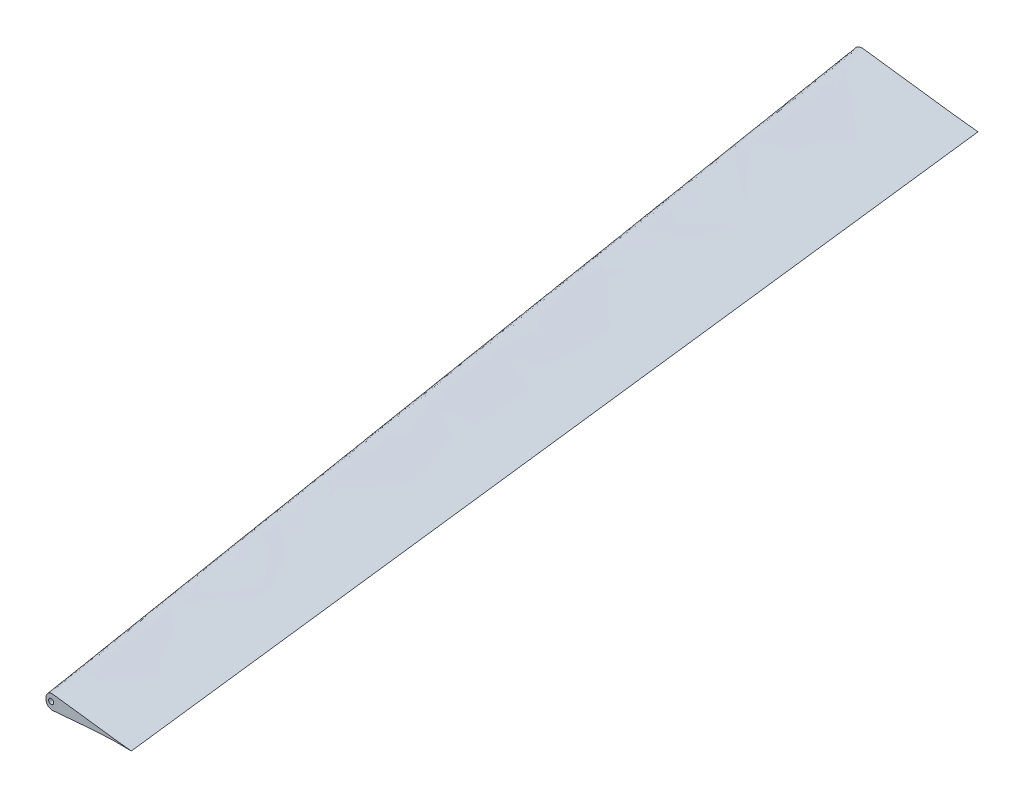
ISO-10303-21;
HEADER;
FILE_DESCRIPTION(('STEP AP214'),'2;1');
FILE_NAME('part.step','',(''),(''),'','','');
FILE_SCHEMA(('AUTOMOTIVE_DESIGN { 1 0 10303 214 1 1 1 1 }'));
ENDSEC;
DATA;
#1=APPLICATION_CONTEXT('core data for automotive mechanical design processes');
#2=APPLICATION_PROTOCOL_DEFINITION('international standard','automotive_design',2000,#1);
#3=PRODUCT_CONTEXT('',#1,'mechanical');
#4=PRODUCT('Part','Part','',(#3));
#5=PRODUCT_RELATED_PRODUCT_CATEGORY('part','',(#4));
#6=PRODUCT_DEFINITION_FORMATION('','',#4);
#7=PRODUCT_DEFINITION_CONTEXT('part definition',#1,'design');
#8=PRODUCT_DEFINITION('design','',#6,#7);
#9=PRODUCT_DEFINITION_SHAPE('','',#8);
#10=(LENGTH_UNIT() NAMED_UNIT(*) SI_UNIT(.MILLI.,.METRE.));
#11=(NAMED_UNIT(*) PLANE_ANGLE_UNIT() SI_UNIT($,.RADIAN.));
#12=(NAMED_UNIT(*) SI_UNIT($,.STERADIAN.) SOLID_ANGLE_UNIT());
#13=UNCERTAINTY_MEASURE_WITH_UNIT(LENGTH_MEASURE(1.E-05),#10,'distance_accuracy_value','');
#14=(GEOMETRIC_REPRESENTATION_CONTEXT(3) GLOBAL_UNCERTAINTY_ASSIGNED_CONTEXT((#13)) GLOBAL_UNIT_ASSIGNED_CONTEXT((#10,
#11,#12)) REPRESENTATION_CONTEXT('',''));
#15=CARTESIAN_POINT('',(0.,0.,0.));
#16=DIRECTION('',(0.,0.,1.));
#17=DIRECTION('',(1.,0.,0.));
#18=AXIS2_PLACEMENT_3D('',#15,#16,#17);
#19=CARTESIAN_POINT('',(572.039507325932,-0.442214374208596,893.75));
#20=DIRECTION('',(0.,0.,1.));
#21=DIRECTION('',(1.,0.,0.));
#22=AXIS2_PLACEMENT_3D('',#19,#20,#21);
#23=PLANE('',#22);
#24=CARTESIAN_POINT('',(544.806644245559,2.04010066238125,893.75));
#25=DIRECTION('',(0.,0.,-1.));
#26=DIRECTION('',(-1.,0.,0.));
#27=AXIS2_PLACEMENT_3D('',#24,#25,#26);
#28=CIRCLE('',#27,1.70999999999994);
#29=CARTESIAN_POINT('',(543.625149017303,0.803909323790661,893.75));
#30=VERTEX_POINT('',#29);
#31=EDGE_CURVE('E182',#30,#30,#28,.T.);
#32=ORIENTED_EDGE('',*,*,#31,.T.);
#33=EDGE_LOOP('',(#32));
#34=FACE_BOUND('',#33,.T.);
#35=CARTESIAN_POINT('',(545.906853580853,-2.62601956861318,893.75));
#36=CARTESIAN_POINT('',(545.343753257404,-2.67841214158187,893.75));
#37=CARTESIAN_POINT('',(544.188046447115,-2.54948777973742,893.749999999999));
#38=CARTESIAN_POINT('',(542.666350876093,-1.66449411174579,893.75));
#39=CARTESIAN_POINT('',(541.630913820492,-0.23276783121427,893.750000000001));
#40=CARTESIAN_POINT('',(541.388775142327,0.91777924490032,893.75));
#41=CARTESIAN_POINT('',(541.388775142327,1.58908134144445,893.75));
#42=CARTESIAN_POINT('',(541.388775142328,1.785135488516,893.75));
#43=CARTESIAN_POINT('',(541.388775142326,2.07963539451153,893.75));
#44=CARTESIAN_POINT('',(541.388775142328,2.37410697351867,893.75));
#45=CARTESIAN_POINT('',(541.388775142327,2.57010474744107,893.75));
#46=CARTESIAN_POINT('',(541.388775142327,3.25414214498161,893.75));
#47=CARTESIAN_POINT('',(541.641485491526,4.42573116966888,893.750000000002));
#48=CARTESIAN_POINT('',(542.711711982757,5.86990965965612,893.749999999998));
#49=CARTESIAN_POINT('',(544.282204790229,6.74484622135366,893.750000000001));
#50=CARTESIAN_POINT('',(545.477140293074,6.84407951933252,893.75));
#51=CARTESIAN_POINT('',(549.481331748966,6.32166351695127,893.75));
#52=CARTESIAN_POINT('',(556.332896968704,5.4092855888834,893.749999999999));
#53=CARTESIAN_POINT('',(566.615586924358,4.02673030335584,893.750000000002));
#54=CARTESIAN_POINT('',(576.887621965339,2.65466190552364,893.749999999999));
#55=CARTESIAN_POINT('',(583.72414637341,1.8134350196239,893.75));
#56=CARTESIAN_POINT('',(588.059111722785,1.28851275945729,893.75));
#57=CARTESIAN_POINT('',(589.888433897396,1.08166745911093,893.75));
#58=CARTESIAN_POINT('',(592.599997890354,0.775065223421604,893.75));
#59=CARTESIAN_POINT('',(595.305520361951,0.469146115241552,893.75));
#60=CARTESIAN_POINT('',(597.122391809964,0.263708644701377,893.75));
#61=CARTESIAN_POINT('',(598.038775142328,0.160091256662315,893.75));
#62=B_SPLINE_CURVE_WITH_KNOTS('',3,(#35,#36,#37,#38,#39,#40,#41,#42,#43,#44,#45,#46,#47,#48,#49,
#50,#51,#52,#53,#54,#55,#56,#57,#58,#59,#60,#61),.UNSPECIFIED.,.F.,.F.,(4,1,1,1,2,1,1,1,2,1,1,1,
2,1,1,1,2,1,1,1,4),(0.,0.0254001879600956,0.0508003759201914,0.076200563880287,
0.101600751840383,0.105936626506359,0.110272501172336,0.114608375838314,0.11894425050429,
0.144920127273649,0.170896004043008,0.196871880812366,0.222847757581725,0.375715324521794,
0.528582891461863,0.681450458401932,0.834318025342001,0.875738519006501,0.917159012671001,
0.9585795063355,1.),.UNSPECIFIED.);
#63=CARTESIAN_POINT('',(587.134573804226,1.39725788910853,893.75));
#64=VERTEX_POINT('',#63);
#65=CARTESIAN_POINT('',(598.038775142328,0.160091256662334,893.75));
#66=VERTEX_POINT('',#65);
#67=EDGE_CURVE('E245',#64,#66,#62,.T.);
#68=ORIENTED_EDGE('',*,*,#67,.F.);
#69=CARTESIAN_POINT('',(545.906853580853,-2.62601956861318,893.75));
#70=CARTESIAN_POINT('',(545.343753257404,-2.67841214158187,893.75));
#71=CARTESIAN_POINT('',(544.188046447115,-2.54948777973742,893.749999999999));
#72=CARTESIAN_POINT('',(542.666350876093,-1.66449411174579,893.75));
#73=CARTESIAN_POINT('',(541.630913820492,-0.23276783121427,893.750000000001));
#74=CARTESIAN_POINT('',(541.388775142327,0.91777924490032,893.75));
#75=CARTESIAN_POINT('',(541.388775142327,1.58908134144445,893.75));
#76=CARTESIAN_POINT('',(541.388775142328,1.785135488516,893.75));
#77=CARTESIAN_POINT('',(541.388775142326,2.07963539451153,893.75));
#78=CARTESIAN_POINT('',(541.388775142328,2.37410697351867,893.75));
#79=CARTESIAN_POINT('',(541.388775142327,2.57010474744107,893.75));
#80=CARTESIAN_POINT('',(541.388775142327,3.25414214498161,893.75));
#81=CARTESIAN_POINT('',(541.641485491526,4.42573116966888,893.750000000002));
#82=CARTESIAN_POINT('',(542.711711982757,5.86990965965612,893.749999999998));
#83=CARTESIAN_POINT('',(544.282204790229,6.74484622135366,893.750000000001));
#84=CARTESIAN_POINT('',(545.477140293074,6.84407951933252,893.75));
#85=CARTESIAN_POINT('',(549.481331748966,6.32166351695127,893.75));
#86=CARTESIAN_POINT('',(556.332896968704,5.4092855888834,893.749999999999));
#87=CARTESIAN_POINT('',(566.615586924358,4.02673030335584,893.750000000002));
#88=CARTESIAN_POINT('',(576.887621965339,2.65466190552364,893.749999999999));
#89=CARTESIAN_POINT('',(583.72414637341,1.8134350196239,893.75));
#90=CARTESIAN_POINT('',(588.059111722785,1.28851275945729,893.75));
#91=CARTESIAN_POINT('',(589.888433897396,1.08166745911093,893.75));
#92=CARTESIAN_POINT('',(592.599997890354,0.775065223421604,893.75));
#93=CARTESIAN_POINT('',(595.305520361951,0.469146115241552,893.75));
#94=CARTESIAN_POINT('',(597.122391809964,0.263708644701377,893.75));
#95=CARTESIAN_POINT('',(598.038775142328,0.160091256662315,893.75));
#96=B_SPLINE_CURVE_WITH_KNOTS('',3,(#69,#70,#71,#72,#73,#74,#75,#76,#77,#78,#79,#80,#81,#82,#83,
#84,#85,#86,#87,#88,#89,#90,#91,#92,#93,#94,#95),.UNSPECIFIED.,.F.,.F.,(4,1,1,1,2,1,1,1,2,1,1,1,
2,1,1,1,2,1,1,1,4),(0.,0.0254001879600956,0.0508003759201914,0.076200563880287,
0.101600751840383,0.105936626506359,0.110272501172336,0.114608375838314,0.11894425050429,
0.144920127273649,0.170896004043008,0.196871880812366,0.222847757581725,0.375715324521794,
0.528582891461863,0.681450458401932,0.834318025342001,0.875738519006501,0.917159012671001,
0.9585795063355,1.),.UNSPECIFIED.);
#97=CARTESIAN_POINT('',(546.058723721344,6.76820190633752,893.75));
#98=VERTEX_POINT('',#97);
#99=EDGE_CURVE('E117',#98,#64,#96,.T.);
#100=ORIENTED_EDGE('',*,*,#99,.F.);
#101=CARTESIAN_POINT('',(545.906853580853,-2.62601956861318,893.75));
#102=CARTESIAN_POINT('',(545.343753257404,-2.67841214158187,893.75));
#103=CARTESIAN_POINT('',(544.188046447115,-2.54948777973742,893.749999999999));
#104=CARTESIAN_POINT('',(542.666350876093,-1.66449411174579,893.75));
#105=CARTESIAN_POINT('',(541.630913820492,-0.23276783121427,893.750000000001));
#106=CARTESIAN_POINT('',(541.388775142327,0.91777924490032,893.75));
#107=CARTESIAN_POINT('',(541.388775142327,1.58908134144445,893.75));
#108=CARTESIAN_POINT('',(541.388775142328,1.785135488516,893.75));
#109=CARTESIAN_POINT('',(541.388775142326,2.07963539451153,893.75));
#110=CARTESIAN_POINT('',(541.388775142328,2.37410697351867,893.75));
#111=CARTESIAN_POINT('',(541.388775142327,2.57010474744107,893.75));
#112=CARTESIAN_POINT('',(541.388775142327,3.25414214498161,893.75));
#113=CARTESIAN_POINT('',(541.641485491526,4.42573116966888,893.750000000002));
#114=CARTESIAN_POINT('',(542.711711982757,5.86990965965612,893.749999999998));
#115=CARTESIAN_POINT('',(544.282204790229,6.74484622135366,893.750000000001));
#116=CARTESIAN_POINT('',(545.477140293074,6.84407951933252,893.75));
#117=CARTESIAN_POINT('',(549.481331748966,6.32166351695127,893.75));
#118=CARTESIAN_POINT('',(556.332896968704,5.4092855888834,893.749999999999));
#119=CARTESIAN_POINT('',(566.615586924358,4.02673030335584,893.750000000002));
#120=CARTESIAN_POINT('',(576.887621965339,2.65466190552364,893.749999999999));
#121=CARTESIAN_POINT('',(583.72414637341,1.8134350196239,893.75));
#122=CARTESIAN_POINT('',(588.059111722785,1.28851275945729,893.75));
#123=CARTESIAN_POINT('',(589.888433897396,1.08166745911093,893.75));
#124=CARTESIAN_POINT('',(592.599997890354,0.775065223421604,893.75));
#125=CARTESIAN_POINT('',(595.305520361951,0.469146115241552,893.75));
#126=CARTESIAN_POINT('',(597.122391809964,0.263708644701377,893.75));
#127=CARTESIAN_POINT('',(598.038775142328,0.160091256662315,893.75));
#128=B_SPLINE_CURVE_WITH_KNOTS('',3,(#101,#102,#103,#104,#105,#106,#107,#108,#109,#110,#111,
#112,#113,#114,#115,#116,#117,#118,#119,#120,#121,#122,#123,#124,#125,#126,#127),.UNSPECIFIED.,
.F.,.F.,(4,1,1,1,2,1,1,1,2,1,1,1,2,1,1,1,2,1,1,1,4),(0.,0.0254001879600956,0.0508003759201914,
0.076200563880287,0.101600751840383,0.105936626506359,0.110272501172336,0.114608375838314,
0.11894425050429,0.144920127273649,0.170896004043008,0.196871880812366,0.222847757581725,
0.375715324521794,0.528582891461863,0.681450458401932,0.834318025342001,0.875738519006501,
0.917159012671001,0.9585795063355,1.),.UNSPECIFIED.);
#129=CARTESIAN_POINT('',(541.388775142327,2.66795130206855,893.75));
#130=VERTEX_POINT('',#129);
#131=EDGE_CURVE('E12',#98,#130,#128,.F.);
#132=ORIENTED_EDGE('',*,*,#131,.T.);
#133=CARTESIAN_POINT('',(545.906853580853,-2.62601956861318,893.75));
#134=CARTESIAN_POINT('',(545.343753257404,-2.67841214158187,893.75));
#135=CARTESIAN_POINT('',(544.188046447115,-2.54948777973742,893.749999999999));
#136=CARTESIAN_POINT('',(542.666350876093,-1.66449411174579,893.75));
#137=CARTESIAN_POINT('',(541.630913820492,-0.23276783121427,893.750000000001));
#138=CARTESIAN_POINT('',(541.388775142327,0.91777924490032,893.75));
#139=CARTESIAN_POINT('',(541.388775142327,1.58908134144445,893.75));
#140=CARTESIAN_POINT('',(541.388775142328,1.785135488516,893.75));
#141=CARTESIAN_POINT('',(541.388775142326,2.07963539451153,893.75));
#142=CARTESIAN_POINT('',(541.388775142328,2.37410697351867,893.75));
#143=CARTESIAN_POINT('',(541.388775142327,2.57010474744107,893.75));
#144=CARTESIAN_POINT('',(541.388775142327,3.25414214498161,893.75));
#145=CARTESIAN_POINT('',(541.641485491526,4.42573116966888,893.750000000002));
#146=CARTESIAN_POINT('',(542.711711982757,5.86990965965612,893.749999999998));
#147=CARTESIAN_POINT('',(544.282204790229,6.74484622135366,893.750000000001));
#148=CARTESIAN_POINT('',(545.477140293074,6.84407951933252,893.75));
#149=CARTESIAN_POINT('',(549.481331748966,6.32166351695127,893.75));
#150=CARTESIAN_POINT('',(556.332896968704,5.4092855888834,893.749999999999));
#151=CARTESIAN_POINT('',(566.615586924358,4.02673030335584,893.750000000002));
#152=CARTESIAN_POINT('',(576.887621965339,2.65466190552364,893.749999999999));
#153=CARTESIAN_POINT('',(583.72414637341,1.8134350196239,893.75));
#154=CARTESIAN_POINT('',(588.059111722785,1.28851275945729,893.75));
#155=CARTESIAN_POINT('',(589.888433897396,1.08166745911093,893.75));
#156=CARTESIAN_POINT('',(592.599997890354,0.775065223421604,893.75));
#157=CARTESIAN_POINT('',(595.305520361951,0.469146115241552,893.75));
#158=CARTESIAN_POINT('',(597.122391809964,0.263708644701377,893.75));
#159=CARTESIAN_POINT('',(598.038775142328,0.160091256662315,893.75));
#160=B_SPLINE_CURVE_WITH_KNOTS('',3,(#133,#134,#135,#136,#137,#138,#139,#140,#141,#142,#143,
#144,#145,#146,#147,#148,#149,#150,#151,#152,#153,#154,#155,#156,#157,#158,#159),.UNSPECIFIED.,
.F.,.F.,(4,1,1,1,2,1,1,1,2,1,1,1,2,1,1,1,2,1,1,1,4),(0.,0.0254001879600956,0.0508003759201914,
0.076200563880287,0.101600751840383,0.105936626506359,0.110272501172336,0.114608375838314,
0.11894425050429,0.144920127273649,0.170896004043008,0.196871880812366,0.222847757581725,
0.375715324521794,0.528582891461863,0.681450458401932,0.834318025342001,0.875738519006501,
0.917159012671001,0.9585795063355,1.),.UNSPECIFIED.);
#161=CARTESIAN_POINT('',(541.388775142327,1.49119744169071,893.75));
#162=VERTEX_POINT('',#161);
#163=EDGE_CURVE('E110',#130,#162,#160,.F.);
#164=ORIENTED_EDGE('',*,*,#163,.T.);
#165=CARTESIAN_POINT('',(545.906853580853,-2.62601956861318,893.75));
#166=CARTESIAN_POINT('',(545.343753257404,-2.67841214158187,893.75));
#167=CARTESIAN_POINT('',(544.188046447115,-2.54948777973742,893.749999999999));
#168=CARTESIAN_POINT('',(542.666350876093,-1.66449411174579,893.75));
#169=CARTESIAN_POINT('',(541.630913820492,-0.23276783121427,893.750000000001));
#170=CARTESIAN_POINT('',(541.388775142327,0.91777924490032,893.75));
#171=CARTESIAN_POINT('',(541.388775142327,1.58908134144445,893.75));
#172=CARTESIAN_POINT('',(541.388775142328,1.785135488516,893.75));
#173=CARTESIAN_POINT('',(541.388775142326,2.07963539451153,893.75));
#174=CARTESIAN_POINT('',(541.388775142328,2.37410697351867,893.75));
#175=CARTESIAN_POINT('',(541.388775142327,2.57010474744107,893.75));
#176=CARTESIAN_POINT('',(541.388775142327,3.25414214498161,893.75));
#177=CARTESIAN_POINT('',(541.641485491526,4.42573116966888,893.750000000002));
#178=CARTESIAN_POINT('',(542.711711982757,5.86990965965612,893.749999999998));
#179=CARTESIAN_POINT('',(544.282204790229,6.74484622135366,893.750000000001));
#180=CARTESIAN_POINT('',(545.477140293074,6.84407951933252,893.75));
#181=CARTESIAN_POINT('',(549.481331748966,6.32166351695127,893.75));
#182=CARTESIAN_POINT('',(556.332896968704,5.4092855888834,893.749999999999));
#183=CARTESIAN_POINT('',(566.615586924358,4.02673030335584,893.750000000002));
#184=CARTESIAN_POINT('',(576.887621965339,2.65466190552364,893.749999999999));
#185=CARTESIAN_POINT('',(583.72414637341,1.8134350196239,893.75));
#186=CARTESIAN_POINT('',(588.059111722785,1.28851275945729,893.75));
#187=CARTESIAN_POINT('',(589.888433897396,1.08166745911093,893.75));
#188=CARTESIAN_POINT('',(592.599997890354,0.775065223421604,893.75));
#189=CARTESIAN_POINT('',(595.305520361951,0.469146115241552,893.75));
#190=CARTESIAN_POINT('',(597.122391809964,0.263708644701377,893.75));
#191=CARTESIAN_POINT('',(598.038775142328,0.160091256662315,893.75));
#192=B_SPLINE_CURVE_WITH_KNOTS('',3,(#165,#166,#167,#168,#169,#170,#171,#172,#173,#174,#175,
#176,#177,#178,#179,#180,#181,#182,#183,#184,#185,#186,#187,#188,#189,#190,#191),.UNSPECIFIED.,
.F.,.F.,(4,1,1,1,2,1,1,1,2,1,1,1,2,1,1,1,2,1,1,1,4),(0.,0.0254001879600956,0.0508003759201914,
0.076200563880287,0.101600751840383,0.105936626506359,0.110272501172336,0.114608375838314,
0.11894425050429,0.144920127273649,0.170896004043008,0.196871880812366,0.222847757581725,
0.375715324521794,0.528582891461863,0.681450458401932,0.834318025342001,0.875738519006501,
0.917159012671001,0.9585795063355,1.),.UNSPECIFIED.);
#193=CARTESIAN_POINT('',(545.906853580853,-2.6260195686132,893.75));
#194=VERTEX_POINT('',#193);
#195=EDGE_CURVE('E252',#194,#162,#192,.T.);
#196=ORIENTED_EDGE('',*,*,#195,.F.);
#197=CARTESIAN_POINT('',(598.038775142328,0.160091256662334,893.75));
#198=CARTESIAN_POINT('',(596.963489152598,0.189650922548275,893.75));
#199=CARTESIAN_POINT('',(594.810181218029,0.249150148179762,893.75));
#200=CARTESIAN_POINT('',(591.572464730382,0.314137795246724,893.75));
#201=CARTESIAN_POINT('',(588.327122261804,0.333378718088079,893.75));
#202=CARTESIAN_POINT('',(585.075938240983,0.277778704308652,893.749999999999));
#203=CARTESIAN_POINT('',(581.821202512504,0.150032608922804,893.75));
#204=CARTESIAN_POINT('',(578.563801740404,-0.0240880564938324,893.75));
#205=CARTESIAN_POINT('',(575.303291550285,-0.22666185000221,893.75));
#206=CARTESIAN_POINT('',(570.952138822432,-0.510852540785951,893.75));
#207=CARTESIAN_POINT('',(565.507304178201,-0.902532391711503,893.749999999999));
#208=CARTESIAN_POINT('',(558.971254363327,-1.44090805514548,893.75));
#209=CARTESIAN_POINT('',(552.436151520526,-2.02251126759789,893.749999999999));
#210=CARTESIAN_POINT('',(548.082334278727,-2.42360620378526,893.75));
#211=CARTESIAN_POINT('',(545.906853580853,-2.6260195686132,893.75));
#212=B_SPLINE_CURVE_WITH_KNOTS('',3,(#197,#198,#199,#200,#201,#202,#203,#204,#205,#206,#207,
#208,#209,#210,#211),.UNSPECIFIED.,.F.,.F.,(4,1,1,1,1,1,1,1,1,1,1,1,4),(0.,0.0625,0.125,0.1875,
0.25,0.3125,0.375,0.4375,0.5,0.625,0.75,0.875,1.),.UNSPECIFIED.);
#213=EDGE_CURVE('E188',#66,#194,#212,.T.);
#214=ORIENTED_EDGE('',*,*,#213,.F.);
#215=EDGE_LOOP('',(#68,#100,#132,#164,#196,#214));
#216=FACE_BOUND('',#215,.T.);
#217=ADVANCED_FACE('F99',(#34,#216),#23,.T.);
#218=CARTESIAN_POINT('',(446.228775142328,2.16644841293175,256.250000000001));
#219=DIRECTION('',(0.,0.,-1.));
#220=DIRECTION('',(0.,1.,0.));
#221=AXIS2_PLACEMENT_3D('',#218,#219,#220);
#222=PLANE('',#221);
#223=CARTESIAN_POINT('',(445.225541599502,2.95993305744458,256.25));
#224=DIRECTION('',(0.,0.,1.));
#225=DIRECTION('',(1.,0.,0.));
#226=AXIS2_PLACEMENT_3D('',#223,#224,#225);
#227=CIRCLE('',#226,2.50000000000002);
#228=CARTESIAN_POINT('',(444.341854490053,0.621322980369886,256.25));
#229=VERTEX_POINT('',#228);
#230=EDGE_CURVE('E329',#229,#229,#227,.T.);
#231=ORIENTED_EDGE('',*,*,#230,.T.);
#232=EDGE_LOOP('',(#231));
#233=FACE_BOUND('',#232,.T.);
#234=CARTESIAN_POINT('',(523.038775142327,0.160091256662353,256.25));
#235=CARTESIAN_POINT('',(521.673146574801,0.314505746975743,256.25));
#236=CARTESIAN_POINT('',(518.918898392362,0.625934373617722,256.25));
#237=CARTESIAN_POINT('',(514.756573565062,1.09657718382981,256.250000000001));
#238=CARTESIAN_POINT('',(510.604449257664,1.56606659983249,256.25));
#239=CARTESIAN_POINT('',(507.869939246934,1.87526338994398,256.25));
#240=CARTESIAN_POINT('',(501.529545710944,2.64302355341035,256.25));
#241=CARTESIAN_POINT('',(491.578616671158,3.86635621279561,256.25));
#242=CARTESIAN_POINT('',(476.716016613758,5.84463513256558,256.25));
#243=CARTESIAN_POINT('',(461.873412085842,7.8418786764479,256.25));
#244=CARTESIAN_POINT('',(451.969936678682,9.16311978809007,256.25));
#245=CARTESIAN_POINT('',(446.167923779959,9.92567651045919,256.25));
#246=CARTESIAN_POINT('',(444.43417913672,9.78411692300939,256.25));
#247=CARTESIAN_POINT('',(442.151430173305,8.51557529366046,256.250000000001));
#248=CARTESIAN_POINT('',(440.595458182039,6.41770209319717,256.250000000001));
#249=CARTESIAN_POINT('',(440.228775142328,4.71650192128603,256.250000000001));
#250=CARTESIAN_POINT('',(440.228775142328,3.72412751189366,256.250000000001));
#251=CARTESIAN_POINT('',(440.228775142329,3.44067196187531,256.250000000001));
#252=CARTESIAN_POINT('',(440.228775142327,3.01617574176739,256.25));
#253=CARTESIAN_POINT('',(440.228775142328,2.59171998437292,256.250000000001));
#254=CARTESIAN_POINT('',(440.228775142328,2.30834575931876,256.250000000001));
#255=CARTESIAN_POINT('',(440.228775142328,1.33519301036386,256.250000000001));
#256=CARTESIAN_POINT('',(440.578228188802,-0.321395515843099,256.250000000001));
#257=CARTESIAN_POINT('',(442.054960574719,-2.38303525490176,256.250000000001));
#258=CARTESIAN_POINT('',(444.243251918863,-3.68209204839669,256.250000000001));
#259=CARTESIAN_POINT('',(445.942219837113,-3.88567187744866,256.250000000001));
#260=CARTESIAN_POINT('',(446.781414839283,-3.80804649168994,256.250000000001));
#261=B_SPLINE_CURVE_WITH_KNOTS('',3,(#234,#235,#236,#237,#238,#239,#240,#241,#242,#243,#244,
#245,#246,#247,#248,#249,#250,#251,#252,#253,#254,#255,#256,#257,#258,#259,#260),.UNSPECIFIED.,
.F.,.F.,(4,1,1,1,2,1,1,1,2,1,1,1,2,1,1,1,2,1,1,1,4),(0.,0.0414204936644997,0.0828409873289994,
0.124261480993499,0.165681974657999,0.318549541598068,0.471417108538137,0.624284675478206,
0.777152242418275,0.803128119187634,0.829103995956992,0.855079872726351,0.88105574949571,
0.885391624161686,0.889727498827664,0.894063373493641,0.898399248159617,0.923799436119713,
0.949199624079809,0.974599812039904,1.),.UNSPECIFIED.);
#262=CARTESIAN_POINT('',(446.781414839283,-3.80804649168991,256.250000000001));
#263=VERTEX_POINT('',#262);
#264=CARTESIAN_POINT('',(440.228775142328,2.16644841295228,256.250000000001));
#265=VERTEX_POINT('',#264);
#266=EDGE_CURVE('E160',#263,#265,#261,.F.);
#267=ORIENTED_EDGE('',*,*,#266,.T.);
#268=CARTESIAN_POINT('',(523.038775142327,0.160091256662353,256.25));
#269=CARTESIAN_POINT('',(521.673146574801,0.314505746975743,256.25));
#270=CARTESIAN_POINT('',(518.918898392362,0.625934373617722,256.25));
#271=CARTESIAN_POINT('',(514.756573565062,1.09657718382981,256.250000000001));
#272=CARTESIAN_POINT('',(510.604449257664,1.56606659983249,256.25));
#273=CARTESIAN_POINT('',(507.869939246934,1.87526338994398,256.25));
#274=CARTESIAN_POINT('',(501.529545710944,2.64302355341035,256.25));
#275=CARTESIAN_POINT('',(491.578616671158,3.86635621279561,256.25));
#276=CARTESIAN_POINT('',(476.716016613758,5.84463513256558,256.25));
#277=CARTESIAN_POINT('',(461.873412085842,7.8418786764479,256.25));
#278=CARTESIAN_POINT('',(451.969936678682,9.16311978809007,256.25));
#279=CARTESIAN_POINT('',(446.167923779959,9.92567651045919,256.25));
#280=CARTESIAN_POINT('',(444.43417913672,9.78411692300939,256.25));
#281=CARTESIAN_POINT('',(442.151430173305,8.51557529366046,256.250000000001));
#282=CARTESIAN_POINT('',(440.595458182039,6.41770209319717,256.250000000001));
#283=CARTESIAN_POINT('',(440.228775142328,4.71650192128603,256.250000000001));
#284=CARTESIAN_POINT('',(440.228775142328,3.72412751189366,256.250000000001));
#285=CARTESIAN_POINT('',(440.228775142329,3.44067196187531,256.250000000001));
#286=CARTESIAN_POINT('',(440.228775142327,3.01617574176739,256.25));
#287=CARTESIAN_POINT('',(440.228775142328,2.59171998437292,256.250000000001));
#288=CARTESIAN_POINT('',(440.228775142328,2.30834575931876,256.250000000001));
#289=CARTESIAN_POINT('',(440.228775142328,1.33519301036386,256.250000000001));
#290=CARTESIAN_POINT('',(440.578228188802,-0.321395515843099,256.250000000001));
#291=CARTESIAN_POINT('',(442.054960574719,-2.38303525490176,256.250000000001));
#292=CARTESIAN_POINT('',(444.243251918863,-3.68209204839669,256.250000000001));
#293=CARTESIAN_POINT('',(445.942219837113,-3.88567187744866,256.250000000001));
#294=CARTESIAN_POINT('',(446.781414839283,-3.80804649168994,256.250000000001));
#295=B_SPLINE_CURVE_WITH_KNOTS('',3,(#268,#269,#270,#271,#272,#273,#274,#275,#276,#277,#278,
#279,#280,#281,#282,#283,#284,#285,#286,#287,#288,#289,#290,#291,#292,#293,#294),.UNSPECIFIED.,
.F.,.F.,(4,1,1,1,2,1,1,1,2,1,1,1,2,1,1,1,2,1,1,1,4),(0.,0.0414204936644997,0.0828409873289994,
0.124261480993499,0.165681974657999,0.318549541598068,0.471417108538137,0.624284675478206,
0.777152242418275,0.803128119187634,0.829103995956992,0.855079872726351,0.88105574949571,
0.885391624161686,0.889727498827664,0.894063373493641,0.898399248159617,0.923799436119713,
0.949199624079809,0.974599812039904,1.),.UNSPECIFIED.);
#296=CARTESIAN_POINT('',(440.228775142328,3.86607942447746,256.250000000001));
#297=VERTEX_POINT('',#296);
#298=EDGE_CURVE('E179',#297,#265,#295,.T.);
#299=ORIENTED_EDGE('',*,*,#298,.F.);
#300=CARTESIAN_POINT('',(523.038775142327,0.160091256662353,256.25));
#301=CARTESIAN_POINT('',(521.673146574801,0.314505746975743,256.25));
#302=CARTESIAN_POINT('',(518.918898392362,0.625934373617722,256.25));
#303=CARTESIAN_POINT('',(514.756573565062,1.09657718382981,256.250000000001));
#304=CARTESIAN_POINT('',(510.604449257664,1.56606659983249,256.25));
#305=CARTESIAN_POINT('',(507.869939246934,1.87526338994398,256.25));
#306=CARTESIAN_POINT('',(501.529545710944,2.64302355341035,256.25));
#307=CARTESIAN_POINT('',(491.578616671158,3.86635621279561,256.25));
#308=CARTESIAN_POINT('',(476.716016613758,5.84463513256558,256.25));
#309=CARTESIAN_POINT('',(461.873412085842,7.8418786764479,256.25));
#310=CARTESIAN_POINT('',(451.969936678682,9.16311978809007,256.25));
#311=CARTESIAN_POINT('',(446.167923779959,9.92567651045919,256.25));
#312=CARTESIAN_POINT('',(444.43417913672,9.78411692300939,256.25));
#313=CARTESIAN_POINT('',(442.151430173305,8.51557529366046,256.250000000001));
#314=CARTESIAN_POINT('',(440.595458182039,6.41770209319717,256.250000000001));
#315=CARTESIAN_POINT('',(440.228775142328,4.71650192128603,256.250000000001));
#316=CARTESIAN_POINT('',(440.228775142328,3.72412751189366,256.250000000001));
#317=CARTESIAN_POINT('',(440.228775142329,3.44067196187531,256.250000000001));
#318=CARTESIAN_POINT('',(440.228775142327,3.01617574176739,256.25));
#319=CARTESIAN_POINT('',(440.228775142328,2.59171998437292,256.250000000001));
#320=CARTESIAN_POINT('',(440.228775142328,2.30834575931876,256.250000000001));
#321=CARTESIAN_POINT('',(440.228775142328,1.33519301036386,256.250000000001));
#322=CARTESIAN_POINT('',(440.578228188802,-0.321395515843099,256.250000000001));
#323=CARTESIAN_POINT('',(442.054960574719,-2.38303525490176,256.250000000001));
#324=CARTESIAN_POINT('',(444.243251918863,-3.68209204839669,256.250000000001));
#325=CARTESIAN_POINT('',(445.942219837113,-3.88567187744866,256.250000000001));
#326=CARTESIAN_POINT('',(446.781414839283,-3.80804649168994,256.250000000001));
#327=B_SPLINE_CURVE_WITH_KNOTS('',3,(#300,#301,#302,#303,#304,#305,#306,#307,#308,#309,#310,
#311,#312,#313,#314,#315,#316,#317,#318,#319,#320,#321,#322,#323,#324,#325,#326),.UNSPECIFIED.,
.F.,.F.,(4,1,1,1,2,1,1,1,2,1,1,1,2,1,1,1,2,1,1,1,4),(0.,0.0414204936644997,0.0828409873289994,
0.124261480993499,0.165681974657999,0.318549541598068,0.471417108538137,0.624284675478206,
0.777152242418275,0.803128119187634,0.829103995956992,0.855079872726351,0.88105574949571,
0.885391624161686,0.889727498827664,0.894063373493641,0.898399248159617,0.923799436119713,
0.949199624079809,0.974599812039904,1.),.UNSPECIFIED.);
#328=CARTESIAN_POINT('',(447.01062937725,9.81491998002588,256.25));
#329=VERTEX_POINT('',#328);
#330=EDGE_CURVE('E369',#329,#297,#327,.T.);
#331=ORIENTED_EDGE('',*,*,#330,.F.);
#332=CARTESIAN_POINT('',(523.038775142327,0.160091256662353,256.25));
#333=CARTESIAN_POINT('',(521.673146574801,0.314505746975743,256.25));
#334=CARTESIAN_POINT('',(518.918898392362,0.625934373617722,256.25));
#335=CARTESIAN_POINT('',(514.756573565062,1.09657718382981,256.250000000001));
#336=CARTESIAN_POINT('',(510.604449257664,1.56606659983249,256.25));
#337=CARTESIAN_POINT('',(507.869939246934,1.87526338994398,256.25));
#338=CARTESIAN_POINT('',(501.529545710944,2.64302355341035,256.25));
#339=CARTESIAN_POINT('',(491.578616671158,3.86635621279561,256.25));
#340=CARTESIAN_POINT('',(476.716016613758,5.84463513256558,256.25));
#341=CARTESIAN_POINT('',(461.873412085842,7.8418786764479,256.25));
#342=CARTESIAN_POINT('',(451.969936678682,9.16311978809007,256.25));
#343=CARTESIAN_POINT('',(446.167923779959,9.92567651045919,256.25));
#344=CARTESIAN_POINT('',(444.43417913672,9.78411692300939,256.25));
#345=CARTESIAN_POINT('',(442.151430173305,8.51557529366046,256.250000000001));
#346=CARTESIAN_POINT('',(440.595458182039,6.41770209319717,256.250000000001));
#347=CARTESIAN_POINT('',(440.228775142328,4.71650192128603,256.250000000001));
#348=CARTESIAN_POINT('',(440.228775142328,3.72412751189366,256.250000000001));
#349=CARTESIAN_POINT('',(440.228775142329,3.44067196187531,256.250000000001));
#350=CARTESIAN_POINT('',(440.228775142327,3.01617574176739,256.25));
#351=CARTESIAN_POINT('',(440.228775142328,2.59171998437292,256.250000000001));
#352=CARTESIAN_POINT('',(440.228775142328,2.30834575931876,256.250000000001));
#353=CARTESIAN_POINT('',(440.228775142328,1.33519301036386,256.250000000001));
#354=CARTESIAN_POINT('',(440.578228188802,-0.321395515843099,256.250000000001));
#355=CARTESIAN_POINT('',(442.054960574719,-2.38303525490176,256.250000000001));
#356=CARTESIAN_POINT('',(444.243251918863,-3.68209204839669,256.250000000001));
#357=CARTESIAN_POINT('',(445.942219837113,-3.88567187744866,256.250000000001));
#358=CARTESIAN_POINT('',(446.781414839283,-3.80804649168994,256.250000000001));
#359=B_SPLINE_CURVE_WITH_KNOTS('',3,(#332,#333,#334,#335,#336,#337,#338,#339,#340,#341,#342,
#343,#344,#345,#346,#347,#348,#349,#350,#351,#352,#353,#354,#355,#356,#357,#358),.UNSPECIFIED.,
.F.,.F.,(4,1,1,1,2,1,1,1,2,1,1,1,2,1,1,1,2,1,1,1,4),(0.,0.0414204936644997,0.0828409873289994,
0.124261480993499,0.165681974657999,0.318549541598068,0.471417108538137,0.624284675478206,
0.777152242418275,0.803128119187634,0.829103995956992,0.855079872726351,0.88105574949571,
0.885391624161686,0.889727498827664,0.894063373493641,0.898399248159617,0.923799436119713,
0.949199624079809,0.974599812039904,1.),.UNSPECIFIED.);
#360=CARTESIAN_POINT('',(506.517666804973,2.03408737035826,256.25));
#361=VERTEX_POINT('',#360);
#362=EDGE_CURVE('E171',#361,#329,#359,.T.);
#363=ORIENTED_EDGE('',*,*,#362,.F.);
#364=CARTESIAN_POINT('',(523.038775142327,0.160091256662353,256.25));
#365=CARTESIAN_POINT('',(521.673146574801,0.314505746975743,256.25));
#366=CARTESIAN_POINT('',(518.918898392362,0.625934373617722,256.25));
#367=CARTESIAN_POINT('',(514.756573565062,1.09657718382981,256.250000000001));
#368=CARTESIAN_POINT('',(510.604449257664,1.56606659983249,256.25));
#369=CARTESIAN_POINT('',(507.869939246934,1.87526338994398,256.25));
#370=CARTESIAN_POINT('',(501.529545710944,2.64302355341035,256.25));
#371=CARTESIAN_POINT('',(491.578616671158,3.86635621279561,256.25));
#372=CARTESIAN_POINT('',(476.716016613758,5.84463513256558,256.25));
#373=CARTESIAN_POINT('',(461.873412085842,7.8418786764479,256.25));
#374=CARTESIAN_POINT('',(451.969936678682,9.16311978809007,256.25));
#375=CARTESIAN_POINT('',(446.167923779959,9.92567651045919,256.25));
#376=CARTESIAN_POINT('',(444.43417913672,9.78411692300939,256.25));
#377=CARTESIAN_POINT('',(442.151430173305,8.51557529366046,256.250000000001));
#378=CARTESIAN_POINT('',(440.595458182039,6.41770209319717,256.250000000001));
#379=CARTESIAN_POINT('',(440.228775142328,4.71650192128603,256.250000000001));
#380=CARTESIAN_POINT('',(440.228775142328,3.72412751189366,256.250000000001));
#381=CARTESIAN_POINT('',(440.228775142329,3.44067196187531,256.250000000001));
#382=CARTESIAN_POINT('',(440.228775142327,3.01617574176739,256.25));
#383=CARTESIAN_POINT('',(440.228775142328,2.59171998437292,256.250000000001));
#384=CARTESIAN_POINT('',(440.228775142328,2.30834575931876,256.250000000001));
#385=CARTESIAN_POINT('',(440.228775142328,1.33519301036386,256.250000000001));
#386=CARTESIAN_POINT('',(440.578228188802,-0.321395515843099,256.250000000001));
#387=CARTESIAN_POINT('',(442.054960574719,-2.38303525490176,256.250000000001));
#388=CARTESIAN_POINT('',(444.243251918863,-3.68209204839669,256.250000000001));
#389=CARTESIAN_POINT('',(445.942219837113,-3.88567187744866,256.250000000001));
#390=CARTESIAN_POINT('',(446.781414839283,-3.80804649168994,256.250000000001));
#391=B_SPLINE_CURVE_WITH_KNOTS('',3,(#364,#365,#366,#367,#368,#369,#370,#371,#372,#373,#374,
#375,#376,#377,#378,#379,#380,#381,#382,#383,#384,#385,#386,#387,#388,#389,#390),.UNSPECIFIED.,
.F.,.F.,(4,1,1,1,2,1,1,1,2,1,1,1,2,1,1,1,2,1,1,1,4),(0.,0.0414204936644997,0.0828409873289994,
0.124261480993499,0.165681974657999,0.318549541598068,0.471417108538137,0.624284675478206,
0.777152242418275,0.803128119187634,0.829103995956992,0.855079872726351,0.88105574949571,
0.885391624161686,0.889727498827664,0.894063373493641,0.898399248159617,0.923799436119713,
0.949199624079809,0.974599812039904,1.),.UNSPECIFIED.);
#392=CARTESIAN_POINT('',(523.038775142327,0.160091256662357,256.25));
#393=VERTEX_POINT('',#392);
#394=EDGE_CURVE('E163',#393,#361,#391,.T.);
#395=ORIENTED_EDGE('',*,*,#394,.F.);
#396=CARTESIAN_POINT('',(446.781414839283,-3.80804649168991,256.250000000001));
#397=CARTESIAN_POINT('',(449.964925045047,-3.5135723740529,256.250000000001));
#398=CARTESIAN_POINT('',(456.335418886569,-2.93107968665316,256.250000000001));
#399=CARTESIAN_POINT('',(465.896043227361,-2.09048669150931,256.25));
#400=CARTESIAN_POINT('',(475.457189594059,-1.32065694543095,256.250000000001));
#401=CARTESIAN_POINT('',(483.421088311034,-0.760582904236392,256.250000000001));
#402=CARTESIAN_POINT('',(489.784785737788,-0.350406576949423,256.25));
#403=CARTESIAN_POINT('',(494.553451582624,-0.0600266392650885,256.25));
#404=CARTESIAN_POINT('',(499.317820035474,0.182934029865403,256.25));
#405=CARTESIAN_POINT('',(504.078400663446,0.356161574986219,256.25));
#406=CARTESIAN_POINT('',(508.833573368103,0.422847759725732,256.250000000001));
#407=CARTESIAN_POINT('',(513.580160625605,0.387829626296951,256.25));
#408=CARTESIAN_POINT('',(518.315910027584,0.290336677356713,256.25));
#409=CARTESIAN_POINT('',(521.465776330364,0.203333073039301,256.25));
#410=CARTESIAN_POINT('',(523.038775142327,0.160091256662357,256.25));
#411=B_SPLINE_CURVE_WITH_KNOTS('',3,(#396,#397,#398,#399,#400,#401,#402,#403,#404,#405,#406,
#407,#408,#409,#410),.UNSPECIFIED.,.F.,.F.,(4,1,1,1,1,1,1,1,1,1,1,1,4),(0.,0.125,0.25,0.375,0.5,
0.5625,0.625,0.6875,0.75,0.8125,0.875,0.9375,1.),.UNSPECIFIED.);
#412=EDGE_CURVE('E155',#263,#393,#411,.T.);
#413=ORIENTED_EDGE('',*,*,#412,.F.);
#414=EDGE_LOOP('',(#267,#299,#331,#363,#395,#413));
#415=FACE_BOUND('',#414,.T.);
#416=ADVANCED_FACE('F158',(#233,#415),#222,.T.);
#417=CARTESIAN_POINT('',(446.781414839283,-3.80804649168991,256.250000000001));
#418=CARTESIAN_POINT('',(545.906853580853,-2.6260195686132,893.75));
#419=CARTESIAN_POINT('',(449.964925045047,-3.5135723740529,256.250000000001));
#420=CARTESIAN_POINT('',(548.082334278727,-2.42360620378526,893.75));
#421=CARTESIAN_POINT('',(456.335418886569,-2.93107968665316,256.250000000001));
#422=CARTESIAN_POINT('',(552.436151520526,-2.02251126759789,893.749999999999));
#423=CARTESIAN_POINT('',(465.896043227361,-2.09048669150931,256.25));
#424=CARTESIAN_POINT('',(558.971254363327,-1.44090805514548,893.75));
#425=CARTESIAN_POINT('',(475.457189594059,-1.32065694543095,256.250000000001));
#426=CARTESIAN_POINT('',(565.507304178201,-0.902532391711503,893.749999999999));
#427=CARTESIAN_POINT('',(483.421088311034,-0.760582904236392,256.250000000001));
#428=CARTESIAN_POINT('',(570.952138822432,-0.510852540785951,893.75));
#429=CARTESIAN_POINT('',(489.784785737788,-0.350406576949423,256.25));
#430=CARTESIAN_POINT('',(575.303291550285,-0.22666185000221,893.75));
#431=CARTESIAN_POINT('',(494.553451582624,-0.0600266392650885,256.25));
#432=CARTESIAN_POINT('',(578.563801740404,-0.0240880564938324,893.75));
#433=CARTESIAN_POINT('',(499.317820035474,0.182934029865403,256.25));
#434=CARTESIAN_POINT('',(581.821202512504,0.150032608922804,893.75));
#435=CARTESIAN_POINT('',(504.078400663446,0.356161574986219,256.25));
#436=CARTESIAN_POINT('',(585.075938240983,0.277778704308652,893.749999999999));
#437=CARTESIAN_POINT('',(508.833573368103,0.422847759725732,256.250000000001));
#438=CARTESIAN_POINT('',(588.327122261804,0.333378718088079,893.75));
#439=CARTESIAN_POINT('',(513.580160625605,0.387829626296951,256.25));
#440=CARTESIAN_POINT('',(591.572464730382,0.314137795246724,893.75));
#441=CARTESIAN_POINT('',(518.315910027584,0.290336677356713,256.25));
#442=CARTESIAN_POINT('',(594.810181218029,0.249150148179762,893.75));
#443=CARTESIAN_POINT('',(521.465776330364,0.203333073039301,256.25));
#444=CARTESIAN_POINT('',(596.963489152598,0.189650922548275,893.75));
#445=CARTESIAN_POINT('',(523.038775142327,0.160091256662357,256.25));
#446=CARTESIAN_POINT('',(598.038775142328,0.160091256662334,893.75));
#447=B_SPLINE_SURFACE_WITH_KNOTS('',3,1,((#417,#418),(#419,#420),(#421,#422),(#423,#424),(#425,
#426),(#427,#428),(#429,#430),(#431,#432),(#433,#434),(#435,#436),(#437,#438),(#439,#440),(#441,
#442),(#443,#444),(#445,#446)),.UNSPECIFIED.,.F.,.F.,.F.,(4,1,1,1,1,1,1,1,1,1,1,1,4),(2,2),(0.,
0.125,0.25,0.375,0.5,0.5625,0.625,0.6875,0.75,0.8125,0.875,0.9375,1.),(0.,1.),.UNSPECIFIED.);
#448=CARTESIAN_POINT('',(523.038775142327,0.160091256662357,256.25));
#449=CARTESIAN_POINT('',(598.038775142328,0.160091256662334,893.75));
#450=B_SPLINE_CURVE_WITH_KNOTS('',1,(#448,#449),.UNSPECIFIED.,.F.,.F.,(2,2),(0.,1.),.UNSPECIFIED.);
#451=EDGE_CURVE('E191',#393,#66,#450,.T.);
#452=CARTESIAN_POINT('',(545.906853580853,-2.6260195686132,893.75));
#453=CARTESIAN_POINT('',(446.781414839283,-3.80804649168991,256.250000000001));
#454=B_SPLINE_CURVE_WITH_KNOTS('',1,(#452,#453),.UNSPECIFIED.,.F.,.F.,(2,2),(0.,1.),.UNSPECIFIED.);
#455=EDGE_CURVE('E170',#194,#263,#454,.T.);
#456=ORIENTED_EDGE('',*,*,#412,.T.);
#457=ORIENTED_EDGE('',*,*,#451,.T.);
#458=ORIENTED_EDGE('',*,*,#213,.T.);
#459=ORIENTED_EDGE('',*,*,#455,.T.);
#460=EDGE_LOOP('',(#456,#457,#458,#459));
#461=FACE_BOUND('',#460,.T.);
#462=ADVANCED_FACE('F187',(#461),#447,.T.);
#463=CARTESIAN_POINT('',(523.038775142327,0.160091256662353,256.25));
#464=CARTESIAN_POINT('',(598.038775142328,0.160091256662315,893.75));
#465=CARTESIAN_POINT('',(521.673146574801,0.314505746975743,256.25));
#466=CARTESIAN_POINT('',(597.122391809964,0.263708644701377,893.75));
#467=CARTESIAN_POINT('',(518.918898392362,0.625934373617722,256.25));
#468=CARTESIAN_POINT('',(595.305520361951,0.469146115241552,893.75));
#469=CARTESIAN_POINT('',(514.756573565062,1.09657718382981,256.250000000001));
#470=CARTESIAN_POINT('',(592.599997890354,0.775065223421604,893.75));
#471=CARTESIAN_POINT('',(510.604449257664,1.56606659983249,256.25));
#472=CARTESIAN_POINT('',(589.888433897396,1.08166745911093,893.75));
#473=CARTESIAN_POINT('',(507.869939246934,1.87526338994398,256.25));
#474=CARTESIAN_POINT('',(588.059111722785,1.28851275945729,893.75));
#475=CARTESIAN_POINT('',(501.529545710944,2.64302355341035,256.25));
#476=CARTESIAN_POINT('',(583.72414637341,1.8134350196239,893.75));
#477=CARTESIAN_POINT('',(491.578616671158,3.86635621279561,256.25));
#478=CARTESIAN_POINT('',(576.887621965339,2.65466190552364,893.749999999999));
#479=CARTESIAN_POINT('',(476.716016613758,5.84463513256558,256.25));
#480=CARTESIAN_POINT('',(566.615586924358,4.02673030335584,893.750000000002));
#481=CARTESIAN_POINT('',(461.873412085842,7.8418786764479,256.25));
#482=CARTESIAN_POINT('',(556.332896968704,5.4092855888834,893.749999999999));
#483=CARTESIAN_POINT('',(451.969936678682,9.16311978809007,256.25));
#484=CARTESIAN_POINT('',(549.481331748966,6.32166351695127,893.75));
#485=CARTESIAN_POINT('',(446.167923779959,9.92567651045919,256.25));
#486=CARTESIAN_POINT('',(545.477140293074,6.84407951933252,893.75));
#487=CARTESIAN_POINT('',(444.43417913672,9.78411692300939,256.25));
#488=CARTESIAN_POINT('',(544.282204790229,6.74484622135366,893.750000000001));
#489=CARTESIAN_POINT('',(442.151430173305,8.51557529366046,256.250000000001));
#490=CARTESIAN_POINT('',(542.711711982757,5.86990965965612,893.749999999998));
#491=CARTESIAN_POINT('',(440.595458182039,6.41770209319717,256.250000000001));
#492=CARTESIAN_POINT('',(541.641485491526,4.42573116966888,893.750000000002));
#493=CARTESIAN_POINT('',(440.228775142328,4.71650192128603,256.250000000001));
#494=CARTESIAN_POINT('',(541.388775142327,3.25414214498161,893.75));
#495=CARTESIAN_POINT('',(440.228775142328,3.72412751189366,256.250000000001));
#496=CARTESIAN_POINT('',(541.388775142327,2.57010474744107,893.75));
#497=CARTESIAN_POINT('',(440.228775142329,3.44067196187531,256.250000000001));
#498=CARTESIAN_POINT('',(541.388775142328,2.37410697351867,893.75));
#499=CARTESIAN_POINT('',(440.228775142327,3.01617574176739,256.25));
#500=CARTESIAN_POINT('',(541.388775142326,2.07963539451153,893.75));
#501=CARTESIAN_POINT('',(440.228775142328,2.59171998437292,256.250000000001));
#502=CARTESIAN_POINT('',(541.388775142328,1.785135488516,893.75));
#503=CARTESIAN_POINT('',(440.228775142328,2.30834575931876,256.250000000001));
#504=CARTESIAN_POINT('',(541.388775142327,1.58908134144445,893.75));
#505=CARTESIAN_POINT('',(440.228775142328,1.33519301036386,256.250000000001));
#506=CARTESIAN_POINT('',(541.388775142327,0.91777924490032,893.75));
#507=CARTESIAN_POINT('',(440.578228188802,-0.321395515843099,256.250000000001));
#508=CARTESIAN_POINT('',(541.630913820492,-0.23276783121427,893.750000000001));
#509=CARTESIAN_POINT('',(442.054960574719,-2.38303525490176,256.250000000001));
#510=CARTESIAN_POINT('',(542.666350876093,-1.66449411174579,893.75));
#511=CARTESIAN_POINT('',(444.243251918863,-3.68209204839669,256.250000000001));
#512=CARTESIAN_POINT('',(544.188046447115,-2.54948777973742,893.749999999999));
#513=CARTESIAN_POINT('',(445.942219837113,-3.88567187744866,256.250000000001));
#514=CARTESIAN_POINT('',(545.343753257404,-2.67841214158187,893.75));
#515=CARTESIAN_POINT('',(446.781414839283,-3.80804649168994,256.250000000001));
#516=CARTESIAN_POINT('',(545.906853580853,-2.62601956861318,893.75));
#517=B_SPLINE_SURFACE_WITH_KNOTS('',3,1,((#463,#464),(#465,#466),(#467,#468),(#469,#470),(#471,
#472),(#473,#474),(#475,#476),(#477,#478),(#479,#480),(#481,#482),(#483,#484),(#485,#486),(#487,
#488),(#489,#490),(#491,#492),(#493,#494),(#495,#496),(#497,#498),(#499,#500),(#501,#502),(#503,
#504),(#505,#506),(#507,#508),(#509,#510),(#511,#512),(#513,#514),(#515,#516)),.UNSPECIFIED.,
.F.,.F.,.F.,(4,1,1,1,2,1,1,1,2,1,1,1,2,1,1,1,2,1,1,1,4),(2,2),(0.,0.0414204936644997,
0.0828409873289994,0.124261480993499,0.165681974657999,0.318549541598068,0.471417108538137,
0.624284675478206,0.777152242418275,0.803128119187634,0.829103995956992,0.855079872726351,
0.88105574949571,0.885391624161686,0.889727498827664,0.894063373493641,0.898399248159617,
0.923799436119713,0.949199624079809,0.974599812039904,1.),(0.,1.),.UNSPECIFIED.);
#518=ORIENTED_EDGE('',*,*,#394,.T.);
#519=ORIENTED_EDGE('',*,*,#362,.T.);
#520=ORIENTED_EDGE('',*,*,#330,.T.);
#521=ORIENTED_EDGE('',*,*,#298,.T.);
#522=ORIENTED_EDGE('',*,*,#266,.F.);
#523=ORIENTED_EDGE('',*,*,#455,.F.);
#524=ORIENTED_EDGE('',*,*,#195,.T.);
#525=ORIENTED_EDGE('',*,*,#163,.F.);
#526=ORIENTED_EDGE('',*,*,#131,.F.);
#527=ORIENTED_EDGE('',*,*,#99,.T.);
#528=ORIENTED_EDGE('',*,*,#67,.T.);
#529=ORIENTED_EDGE('',*,*,#451,.F.);
#530=EDGE_LOOP('',(#518,#519,#520,#521,#522,#523,#524,#525,#526,#527,#528,#529));
#531=FACE_BOUND('',#530,.T.);
#532=ADVANCED_FACE('F176',(#531),#517,.T.);
#533=CARTESIAN_POINT('',(444.341854490053,0.621322980369886,256.25));
#534=CARTESIAN_POINT('',(543.625149017303,0.803909323790661,893.75));
#535=CARTESIAN_POINT('',(444.536738663143,0.54768238791588,256.25));
#536=CARTESIAN_POINT('',(543.728164962185,0.705451388102596,893.75));
#537=CARTESIAN_POINT('',(444.766146335784,0.488078065179592,256.25));
#538=CARTESIAN_POINT('',(543.856669084016,0.60660251014998,893.75));
#539=CARTESIAN_POINT('',(445.29787925624,0.446791920435208,256.25));
#540=CARTESIAN_POINT('',(544.18041571846,0.438474116694814,893.75));
#541=CARTESIAN_POINT('',(445.601611247877,0.466003882291106,256.25));
#542=CARTESIAN_POINT('',(544.376782838398,0.36938130514821,893.75));
#543=CARTESIAN_POINT('',(446.241904668498,0.651661577940786,256.25));
#544=CARTESIAN_POINT('',(544.829542893818,0.31511960396127,893.75));
#545=CARTESIAN_POINT('',(446.578227724347,0.821235497561531,256.25));
#546=CARTESIAN_POINT('',(545.08662192472,0.33198395905507,893.75));
#547=CARTESIAN_POINT('',(447.020638620656,1.20891237341672,256.25));
#548=CARTESIAN_POINT('',(545.468794369462,0.457809678817112,893.749999999999));
#549=CARTESIAN_POINT('',(447.157161341461,1.35964472310802,256.25));
#550=CARTESIAN_POINT('',(545.594923409019,0.516986121849596,893.749999999999));
#551=CARTESIAN_POINT('',(447.392181583836,1.69591218782953,256.25));
#552=CARTESIAN_POINT('',(545.832715048519,0.665876027062094,893.75));
#553=CARTESIAN_POINT('',(447.490511084122,1.88136177490689,256.25));
#554=CARTESIAN_POINT('',(545.944377648462,0.755589489242059,893.75));
#555=CARTESIAN_POINT('',(447.63779226903,2.271130121086,256.25));
#556=CARTESIAN_POINT('',(546.141293519838,0.961621379007162,893.75));
#557=CARTESIAN_POINT('',(447.686674234748,2.47526437446176,256.25));
#558=CARTESIAN_POINT('',(546.225865421474,1.07722689347897,893.75));
#559=CARTESIAN_POINT('',(447.732760613698,2.8829239969801,256.25));
#560=CARTESIAN_POINT('',(546.363849225101,1.32150857029233,893.75));
#561=CARTESIAN_POINT('',(447.730034500905,3.08627409618948,256.25));
#562=CARTESIAN_POINT('',(546.417261127094,1.45018473263386,893.75));
#563=CARTESIAN_POINT('',(447.654552508173,3.66964638728575,256.25));
#564=CARTESIAN_POINT('',(546.525674936299,1.83765645450105,893.75));
#565=CARTESIAN_POINT('',(447.514414106104,4.01926008892835,256.25));
#566=CARTESIAN_POINT('',(546.530896022508,2.09523513153172,893.75));
#567=CARTESIAN_POINT('',(447.156900560506,4.58195761794256,256.25));
#568=CARTESIAN_POINT('',(546.45621444013,2.54507806106765,893.75));
#569=CARTESIAN_POINT('',(446.941772929709,4.79723029314802,256.25));
#570=CARTESIAN_POINT('',(546.378311908413,2.73811965749694,893.75));
#571=CARTESIAN_POINT('',(446.515611162596,5.1179023884336,256.25));
#572=CARTESIAN_POINT('',(546.19571457057,3.05393170953573,893.75));
#573=CARTESIAN_POINT('',(446.304112882039,5.22490254206526,256.25));
#574=CARTESIAN_POINT('',(546.091155418699,3.17783406528378,893.75));
#575=CARTESIAN_POINT('',(445.91434453586,5.37218372697329,256.25));
#576=CARTESIAN_POINT('',(545.885123528933,3.3747499366599,893.75));
#577=CARTESIAN_POINT('',(445.684936863219,5.43178804970958,256.25));
#578=CARTESIAN_POINT('',(545.756619407103,3.47359881461251,893.75));
#579=CARTESIAN_POINT('',(445.153203942763,5.47307419445396,256.25));
#580=CARTESIAN_POINT('',(545.432872772658,3.64172720806768,893.75));
#581=CARTESIAN_POINT('',(444.849471951126,5.45386223259806,256.25));
#582=CARTESIAN_POINT('',(545.236505652721,3.71082001961428,893.75));
#583=CARTESIAN_POINT('',(444.209178530505,5.26820453694838,256.25));
#584=CARTESIAN_POINT('',(544.7837455973,3.76508172080122,893.75));
#585=CARTESIAN_POINT('',(443.872855474656,5.09863061732764,256.25));
#586=CARTESIAN_POINT('',(544.526666566399,3.74821736570742,893.75));
#587=CARTESIAN_POINT('',(443.430444578347,4.71095374147245,256.25));
#588=CARTESIAN_POINT('',(544.144494121657,3.62239164594538,893.75));
#589=CARTESIAN_POINT('',(443.293921857543,4.56022139178116,256.25));
#590=CARTESIAN_POINT('',(544.018365082101,3.56321520291289,893.75));
#591=CARTESIAN_POINT('',(443.058901615167,4.22395392705964,256.25));
#592=CARTESIAN_POINT('',(543.780573442601,3.41432529770039,893.75));
#593=CARTESIAN_POINT('',(442.960572114881,4.03850433998228,256.25));
#594=CARTESIAN_POINT('',(543.668910842657,3.32461183552043,893.75));
#595=CARTESIAN_POINT('',(442.813290929973,3.64873599380317,256.25));
#596=CARTESIAN_POINT('',(543.471994971281,3.11857994575535,893.75));
#597=CARTESIAN_POINT('',(442.764408964255,3.44460174042741,256.25));
#598=CARTESIAN_POINT('',(543.387423069645,3.00297443128356,893.75));
#599=CARTESIAN_POINT('',(442.718322585306,3.03694211790907,256.25));
#600=CARTESIAN_POINT('',(543.249439266018,2.75869275447021,893.75));
#601=CARTESIAN_POINT('',(442.721048698098,2.83359201869969,256.25));
#602=CARTESIAN_POINT('',(543.196027364026,2.63001659212866,893.75));
#603=CARTESIAN_POINT('',(442.79653069083,2.25021972760342,256.25));
#604=CARTESIAN_POINT('',(543.08761355482,2.24254487026144,893.75));
#605=CARTESIAN_POINT('',(442.936669092899,1.90060602596082,256.25));
#606=CARTESIAN_POINT('',(543.082392468611,1.98496619323077,893.75));
#607=CARTESIAN_POINT('',(443.294182638497,1.3379084969466,256.25));
#608=CARTESIAN_POINT('',(543.157074050989,1.53512326369484,893.75));
#609=CARTESIAN_POINT('',(443.509310269294,1.12263582174114,256.25));
#610=CARTESIAN_POINT('',(543.234976582707,1.34208166726556,893.75));
#611=CARTESIAN_POINT('',(443.935472036407,0.801963726455571,256.25));
#612=CARTESIAN_POINT('',(543.417573920549,1.02626961522677,893.75));
#613=CARTESIAN_POINT('',(444.146970316964,0.694963572823886,256.25));
#614=CARTESIAN_POINT('',(543.522133072421,0.902367259478716,893.75));
#615=CARTESIAN_POINT('',(444.341854490053,0.621322980369886,256.25));
#616=CARTESIAN_POINT('',(543.625149017303,0.803909323790661,893.75));
#617=B_SPLINE_SURFACE_WITH_KNOTS('',3,1,((#533,#534),(#535,#536),(#537,#538),(#539,#540),(#541,
#542),(#543,#544),(#545,#546),(#547,#548),(#549,#550),(#551,#552),(#553,#554),(#555,#556),(#557,
#558),(#559,#560),(#561,#562),(#563,#564),(#565,#566),(#567,#568),(#569,#570),(#571,#572),(#573,
#574),(#575,#576),(#577,#578),(#579,#580),(#581,#582),(#583,#584),(#585,#586),(#587,#588),(#589,
#590),(#591,#592),(#593,#594),(#595,#596),(#597,#598),(#599,#600),(#601,#602),(#603,#604),(#605,
#606),(#607,#608),(#609,#610),(#611,#612),(#613,#614),(#615,#616)),.UNSPECIFIED.,.T.,.F.,.F.,(4,
2,2,2,2,2,2,2,2,2,2,2,2,2,2,2,2,2,2,2,4),(2,2),(0.,0.0625,0.125,0.1875,0.218750000000026,0.25,
0.281250000000027,0.3125,0.375,0.4375,0.5,0.5625,0.625,0.6875,0.718750000000028,0.75,
0.781250000000022,0.8125,0.875000000000012,0.937500000000006,1.),(0.,1.),.UNSPECIFIED.);
#618=CARTESIAN_POINT('',(444.341854490053,0.621322980369886,256.25));
#619=CARTESIAN_POINT('',(445.376055474712,0.623224921447186,262.890625));
#620=CARTESIAN_POINT('',(446.410256459371,0.625126862524486,269.53125));
#621=CARTESIAN_POINT('',(448.478658428689,0.628930744679085,282.8125));
#622=CARTESIAN_POINT('',(449.512859413348,0.630832685756385,289.453125));
#623=CARTESIAN_POINT('',(451.581261382665,0.634636567910985,302.734375));
#624=CARTESIAN_POINT('',(452.615462367324,0.636538508988284,309.375));
#625=CARTESIAN_POINT('',(454.683864336642,0.640342391142884,322.65625));
#626=CARTESIAN_POINT('',(455.718065321301,0.642244332220183,329.296875));
#627=CARTESIAN_POINT('',(457.786467290619,0.646048214374783,342.578125));
#628=CARTESIAN_POINT('',(458.820668275277,0.647950155452083,349.21875));
#629=CARTESIAN_POINT('',(460.889070244595,0.651754037606682,362.5));
#630=CARTESIAN_POINT('',(461.923271229254,0.653655978683982,369.140625));
#631=CARTESIAN_POINT('',(463.991673198572,0.657459860838581,382.421875));
#632=CARTESIAN_POINT('',(465.02587418323,0.659361801915881,389.0625));
#633=CARTESIAN_POINT('',(467.094276152548,0.663165684070481,402.34375));
#634=CARTESIAN_POINT('',(468.128477137207,0.66506762514778,408.984375));
#635=CARTESIAN_POINT('',(470.196879106525,0.66887150730238,422.265625));
#636=CARTESIAN_POINT('',(471.231080091183,0.670773448379679,428.90625));
#637=CARTESIAN_POINT('',(473.299482060501,0.674577330534279,442.1875));
#638=CARTESIAN_POINT('',(474.33368304516,0.676479271611579,448.828125));
#639=CARTESIAN_POINT('',(476.402085014478,0.680283153766178,462.109375));
#640=CARTESIAN_POINT('',(477.436285999137,0.682185094843478,468.75));
#641=CARTESIAN_POINT('',(479.504687968454,0.685988976998077,482.03125));
#642=CARTESIAN_POINT('',(480.538888953113,0.687890918075377,488.671875));
#643=CARTESIAN_POINT('',(482.607290922431,0.691694800229977,501.953125));
#644=CARTESIAN_POINT('',(483.64149190709,0.693596741307276,508.59375));
#645=CARTESIAN_POINT('',(485.709893876407,0.697400623461876,521.875));
#646=CARTESIAN_POINT('',(486.744094861066,0.699302564539175,528.515625));
#647=CARTESIAN_POINT('',(488.812496830384,0.703106446693775,541.796875));
#648=CARTESIAN_POINT('',(489.846697815043,0.705008387771075,548.4375));
#649=CARTESIAN_POINT('',(491.91509978436,0.708812269925674,561.71875));
#650=CARTESIAN_POINT('',(492.949300769019,0.710714211002974,568.359375));
#651=CARTESIAN_POINT('',(495.017702738337,0.714518093157573,581.640625));
#652=CARTESIAN_POINT('',(496.051903722996,0.716420034234873,588.28125));
#653=CARTESIAN_POINT('',(498.120305692314,0.720223916389473,601.5625));
#654=CARTESIAN_POINT('',(499.154506676972,0.722125857466772,608.203125));
#655=CARTESIAN_POINT('',(501.22290864629,0.725929739621372,621.484375));
#656=CARTESIAN_POINT('',(502.257109630949,0.727831680698671,628.125));
#657=CARTESIAN_POINT('',(504.325511600267,0.731635562853271,641.40625));
#658=CARTESIAN_POINT('',(505.359712584925,0.733537503930571,648.046875));
#659=CARTESIAN_POINT('',(507.428114554243,0.73734138608517,661.328125));
#660=CARTESIAN_POINT('',(508.462315538902,0.73924332716247,667.96875));
#661=CARTESIAN_POINT('',(510.53071750822,0.743047209317069,681.25));
#662=CARTESIAN_POINT('',(511.564918492879,0.744949150394369,687.890625));
#663=CARTESIAN_POINT('',(513.633320462196,0.748753032548969,701.171875));
#664=CARTESIAN_POINT('',(514.667521446855,0.750654973626268,707.8125));
#665=CARTESIAN_POINT('',(516.735923416173,0.754458855780868,721.09375));
#666=CARTESIAN_POINT('',(517.770124400832,0.756360796858167,727.734375));
#667=CARTESIAN_POINT('',(519.838526370149,0.760164679012767,741.015625));
#668=CARTESIAN_POINT('',(520.872727354808,0.762066620090067,747.65625));
#669=CARTESIAN_POINT('',(522.941129324126,0.765870502244666,760.9375));
#670=CARTESIAN_POINT('',(523.975330308785,0.767772443321966,767.578125));
#671=CARTESIAN_POINT('',(526.043732278102,0.771576325476565,780.859375));
#672=CARTESIAN_POINT('',(527.077933262761,0.773478266553865,787.5));
#673=CARTESIAN_POINT('',(529.146335232079,0.777282148708465,800.78125));
#674=CARTESIAN_POINT('',(530.180536216738,0.779184089785764,807.421875));
#675=CARTESIAN_POINT('',(532.248938186055,0.782987971940364,820.703125));
#676=CARTESIAN_POINT('',(533.283139170714,0.784889913017664,827.34375));
#677=CARTESIAN_POINT('',(535.351541140032,0.788693795172263,840.625));
#678=CARTESIAN_POINT('',(536.385742124691,0.790595736249563,847.265625));
#679=CARTESIAN_POINT('',(538.454144094009,0.794399618404162,860.546875));
#680=CARTESIAN_POINT('',(539.488345078667,0.796301559481462,867.1875));
#681=CARTESIAN_POINT('',(541.556747047985,0.800105441636061,880.46875));
#682=CARTESIAN_POINT('',(542.590948032644,0.802007382713361,887.109375));
#683=CARTESIAN_POINT('',(543.625149017303,0.803909323790661,893.75));
#684=B_SPLINE_CURVE_WITH_KNOTS('',3,(#618,#619,#620,#621,#622,#623,#624,#625,#626,#627,#628,
#629,#630,#631,#632,#633,#634,#635,#636,#637,#638,#639,#640,#641,#642,#643,#644,#645,#646,#647,
#648,#649,#650,#651,#652,#653,#654,#655,#656,#657,#658,#659,#660,#661,#662,#663,#664,#665,#666,
#667,#668,#669,#670,#671,#672,#673,#674,#675,#676,#677,#678,#679,#680,#681,#682,#683),
.UNSPECIFIED.,.F.,.F.,(4,2,2,2,2,2,2,2,2,2,2,2,2,2,2,2,2,2,2,2,2,2,2,2,2,2,2,2,2,2,2,2,4),(0.,
20.1620257206975,40.324051441395,60.4860771620925,80.64810288279,100.810128603487,
120.972154324185,141.134180044882,161.29620576558,181.458231486278,201.620257206975,
221.782282927672,241.94430864837,262.106334369067,282.268360089765,302.430385810462,
322.59241153116,342.754437251858,362.916462972555,383.078488693252,403.24051441395,
423.402540134647,443.564565855345,463.726591576043,483.88861729674,504.050643017437,
524.212668738135,544.374694458833,564.53672017953,584.698745900228,604.860771620925,
625.022797341622,645.18482306232),.UNSPECIFIED.);
#685=EDGE_CURVE('BSEAM424',#229,#30,#684,.T.);
#686=ORIENTED_EDGE('',*,*,#230,.F.);
#687=ORIENTED_EDGE('',*,*,#31,.F.);
#688=ORIENTED_EDGE('',*,*,#685,.T.);
#689=ORIENTED_EDGE('',*,*,#685,.F.);
#690=EDGE_LOOP('',(#686,#688,#687,#689));
#691=FACE_BOUND('',#690,.T.);
#692=ADVANCED_FACE('F424',(#691),#617,.F.);
#693=CLOSED_SHELL('',(#217,#416,#462,#532,#692));
#694=MANIFOLD_SOLID_BREP('B2',#693);
#695=ADVANCED_BREP_SHAPE_REPRESENTATION('',(#18,#694),#14);
#696=SHAPE_DEFINITION_REPRESENTATION(#9,#695);
ENDSEC;
END-ISO-10303-21;
